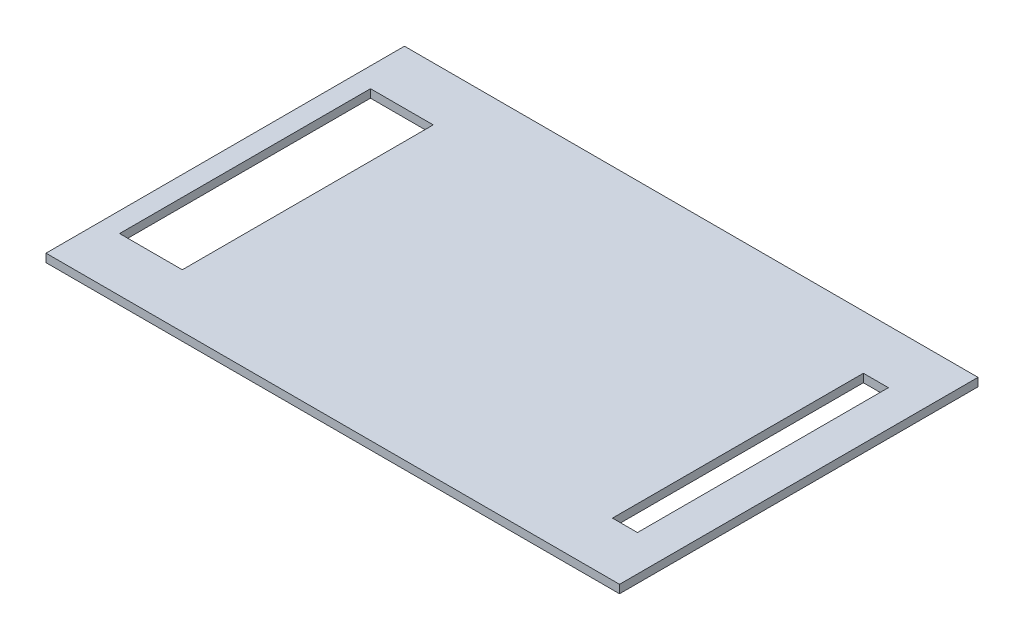
ISO-10303-21;
HEADER;
FILE_DESCRIPTION(('STEP AP214'),'2;1');
FILE_NAME('part.step','',(''),(''),'','','');
FILE_SCHEMA(('AUTOMOTIVE_DESIGN { 1 0 10303 214 1 1 1 1 }'));
ENDSEC;
DATA;
#1=APPLICATION_CONTEXT('core data for automotive mechanical design processes');
#2=APPLICATION_PROTOCOL_DEFINITION('international standard','automotive_design',2000,#1);
#3=PRODUCT_CONTEXT('',#1,'mechanical');
#4=PRODUCT('Part','Part','',(#3));
#5=PRODUCT_RELATED_PRODUCT_CATEGORY('part','',(#4));
#6=PRODUCT_DEFINITION_FORMATION('','',#4);
#7=PRODUCT_DEFINITION_CONTEXT('part definition',#1,'design');
#8=PRODUCT_DEFINITION('design','',#6,#7);
#9=PRODUCT_DEFINITION_SHAPE('','',#8);
#10=(LENGTH_UNIT() NAMED_UNIT(*) SI_UNIT(.MILLI.,.METRE.));
#11=(NAMED_UNIT(*) PLANE_ANGLE_UNIT() SI_UNIT($,.RADIAN.));
#12=(NAMED_UNIT(*) SI_UNIT($,.STERADIAN.) SOLID_ANGLE_UNIT());
#13=UNCERTAINTY_MEASURE_WITH_UNIT(LENGTH_MEASURE(1.E-05),#10,'distance_accuracy_value','');
#14=(GEOMETRIC_REPRESENTATION_CONTEXT(3) GLOBAL_UNCERTAINTY_ASSIGNED_CONTEXT((#13)) GLOBAL_UNIT_ASSIGNED_CONTEXT((#10,
#11,#12)) REPRESENTATION_CONTEXT('',''));
#15=CARTESIAN_POINT('',(0.,0.,0.));
#16=DIRECTION('',(0.,0.,1.));
#17=DIRECTION('',(1.,0.,0.));
#18=AXIS2_PLACEMENT_3D('',#15,#16,#17);
#19=CARTESIAN_POINT('',(0.,5.842,-38.1));
#20=DIRECTION('',(0.,0.,1.));
#21=DIRECTION('',(1.,0.,0.));
#22=AXIS2_PLACEMENT_3D('',#19,#20,#21);
#23=PLANE('',#22);
#24=DIRECTION('',(-1.,0.,0.));
#25=VECTOR('',#24,1.);
#26=CARTESIAN_POINT('',(0.,0.,-38.1));
#27=LINE('',#26,#25);
#28=CARTESIAN_POINT('',(-25.4,0.,-38.1));
#29=VERTEX_POINT('',#28);
#30=CARTESIAN_POINT('',(-43.1165,0.,-38.1));
#31=VERTEX_POINT('',#30);
#32=EDGE_CURVE('E175',#29,#31,#27,.T.);
#33=ORIENTED_EDGE('',*,*,#32,.T.);
#34=DIRECTION('',(0.,-1.,0.));
#35=VECTOR('',#34,1.);
#36=CARTESIAN_POINT('',(-43.1165,5.842,-38.1));
#37=LINE('',#36,#35);
#38=CARTESIAN_POINT('',(-43.1165,5.842,-38.1));
#39=VERTEX_POINT('',#38);
#40=EDGE_CURVE('E11',#39,#31,#37,.T.);
#41=ORIENTED_EDGE('',*,*,#40,.F.);
#42=DIRECTION('',(-1.,0.,0.));
#43=VECTOR('',#42,1.);
#44=CARTESIAN_POINT('',(0.,5.842,-38.1));
#45=LINE('',#44,#43);
#46=CARTESIAN_POINT('',(-25.4,5.842,-38.1));
#47=VERTEX_POINT('',#46);
#48=EDGE_CURVE('E135',#47,#39,#45,.T.);
#49=ORIENTED_EDGE('',*,*,#48,.F.);
#50=DIRECTION('',(0.,-1.,0.));
#51=VECTOR('',#50,1.);
#52=CARTESIAN_POINT('',(-25.4,5.842,-38.1));
#53=LINE('',#52,#51);
#54=EDGE_CURVE('E51',#47,#29,#53,.T.);
#55=ORIENTED_EDGE('',*,*,#54,.T.);
#56=EDGE_LOOP('',(#33,#41,#49,#55));
#57=FACE_BOUND('',#56,.T.);
#58=ADVANCED_FACE('F32',(#57),#23,.F.);
#59=CARTESIAN_POINT('',(-43.1165,5.842,0.));
#60=DIRECTION('',(-1.,0.,0.));
#61=DIRECTION('',(0.,0.,1.));
#62=AXIS2_PLACEMENT_3D('',#59,#60,#61);
#63=PLANE('',#62);
#64=DIRECTION('',(0.,0.,-1.));
#65=VECTOR('',#64,1.);
#66=CARTESIAN_POINT('',(-43.1165,0.,0.));
#67=LINE('',#66,#65);
#68=CARTESIAN_POINT('',(-43.1165,0.,-215.9));
#69=VERTEX_POINT('',#68);
#70=EDGE_CURVE('E141',#31,#69,#67,.T.);
#71=ORIENTED_EDGE('',*,*,#70,.T.);
#72=DIRECTION('',(0.,-1.,0.));
#73=VECTOR('',#72,1.);
#74=CARTESIAN_POINT('',(-43.1165,5.842,-215.9));
#75=LINE('',#74,#73);
#76=CARTESIAN_POINT('',(-43.1165,5.842,-215.9));
#77=VERTEX_POINT('',#76);
#78=EDGE_CURVE('E42',#77,#69,#75,.T.);
#79=ORIENTED_EDGE('',*,*,#78,.F.);
#80=DIRECTION('',(0.,0.,-1.));
#81=VECTOR('',#80,1.);
#82=CARTESIAN_POINT('',(-43.1165,5.842,0.));
#83=LINE('',#82,#81);
#84=EDGE_CURVE('E129',#39,#77,#83,.T.);
#85=ORIENTED_EDGE('',*,*,#84,.F.);
#86=ORIENTED_EDGE('',*,*,#40,.T.);
#87=EDGE_LOOP('',(#71,#79,#85,#86));
#88=FACE_BOUND('',#87,.T.);
#89=ADVANCED_FACE('F140',(#88),#63,.F.);
#90=CARTESIAN_POINT('',(0.,5.842,-215.9));
#91=DIRECTION('',(0.,0.,1.));
#92=DIRECTION('',(1.,0.,0.));
#93=AXIS2_PLACEMENT_3D('',#90,#91,#92);
#94=PLANE('',#93);
#95=DIRECTION('',(-1.,0.,0.));
#96=VECTOR('',#95,1.);
#97=CARTESIAN_POINT('',(0.,0.,-215.9));
#98=LINE('',#97,#96);
#99=CARTESIAN_POINT('',(-25.4,0.,-215.9));
#100=VERTEX_POINT('',#99);
#101=EDGE_CURVE('E178',#100,#69,#98,.T.);
#102=ORIENTED_EDGE('',*,*,#101,.F.);
#103=DIRECTION('',(0.,-1.,0.));
#104=VECTOR('',#103,1.);
#105=CARTESIAN_POINT('',(-25.4,5.842,-215.9));
#106=LINE('',#105,#104);
#107=CARTESIAN_POINT('',(-25.4,5.842,-215.9));
#108=VERTEX_POINT('',#107);
#109=EDGE_CURVE('E89',#108,#100,#106,.T.);
#110=ORIENTED_EDGE('',*,*,#109,.F.);
#111=DIRECTION('',(-1.,0.,0.));
#112=VECTOR('',#111,1.);
#113=CARTESIAN_POINT('',(0.,5.842,-215.9));
#114=LINE('',#113,#112);
#115=EDGE_CURVE('E134',#108,#77,#114,.T.);
#116=ORIENTED_EDGE('',*,*,#115,.T.);
#117=ORIENTED_EDGE('',*,*,#78,.T.);
#118=EDGE_LOOP('',(#102,#110,#116,#117));
#119=FACE_BOUND('',#118,.T.);
#120=ADVANCED_FACE('F145',(#119),#94,.T.);
#121=CARTESIAN_POINT('',(0.,5.842,0.));
#122=DIRECTION('',(1.,0.,0.));
#123=DIRECTION('',(0.,0.,-1.));
#124=AXIS2_PLACEMENT_3D('',#121,#122,#123);
#125=PLANE('',#124);
#126=DIRECTION('',(0.,0.,1.));
#127=VECTOR('',#126,1.);
#128=CARTESIAN_POINT('',(0.,0.,0.));
#129=LINE('',#128,#127);
#130=CARTESIAN_POINT('',(0.,0.,-254.));
#131=VERTEX_POINT('',#130);
#132=CARTESIAN_POINT('',(0.,0.,0.));
#133=VERTEX_POINT('',#132);
#134=EDGE_CURVE('E163',#131,#133,#129,.T.);
#135=ORIENTED_EDGE('',*,*,#134,.F.);
#136=DIRECTION('',(0.,-1.,0.));
#137=VECTOR('',#136,1.);
#138=CARTESIAN_POINT('',(0.,5.842,-254.));
#139=LINE('',#138,#137);
#140=CARTESIAN_POINT('',(0.,5.842,-254.));
#141=VERTEX_POINT('',#140);
#142=EDGE_CURVE('E185',#141,#131,#139,.T.);
#143=ORIENTED_EDGE('',*,*,#142,.F.);
#144=DIRECTION('',(0.,0.,1.));
#145=VECTOR('',#144,1.);
#146=CARTESIAN_POINT('',(0.,5.842,0.));
#147=LINE('',#146,#145);
#148=CARTESIAN_POINT('',(0.,5.842,0.));
#149=VERTEX_POINT('',#148);
#150=EDGE_CURVE('E349',#141,#149,#147,.T.);
#151=ORIENTED_EDGE('',*,*,#150,.T.);
#152=DIRECTION('',(0.,-1.,0.));
#153=VECTOR('',#152,1.);
#154=CARTESIAN_POINT('',(0.,5.842,0.));
#155=LINE('',#154,#153);
#156=EDGE_CURVE('E187',#149,#133,#155,.T.);
#157=ORIENTED_EDGE('',*,*,#156,.T.);
#158=EDGE_LOOP('',(#135,#143,#151,#157));
#159=FACE_BOUND('',#158,.T.);
#160=ADVANCED_FACE('F244',(#159),#125,.T.);
#161=CARTESIAN_POINT('',(0.,5.842,-254.));
#162=DIRECTION('',(0.,0.,-1.));
#163=DIRECTION('',(-1.,0.,0.));
#164=AXIS2_PLACEMENT_3D('',#161,#162,#163);
#165=PLANE('',#164);
#166=DIRECTION('',(1.,0.,0.));
#167=VECTOR('',#166,1.);
#168=CARTESIAN_POINT('',(0.,0.,-254.));
#169=LINE('',#168,#167);
#170=CARTESIAN_POINT('',(-406.4,0.,-254.));
#171=VERTEX_POINT('',#170);
#172=EDGE_CURVE('E166',#171,#131,#169,.T.);
#173=ORIENTED_EDGE('',*,*,#172,.F.);
#174=DIRECTION('',(0.,-1.,0.));
#175=VECTOR('',#174,1.);
#176=CARTESIAN_POINT('',(-406.4,5.842,-254.));
#177=LINE('',#176,#175);
#178=CARTESIAN_POINT('',(-406.4,5.842,-254.));
#179=VERTEX_POINT('',#178);
#180=EDGE_CURVE('E192',#179,#171,#177,.T.);
#181=ORIENTED_EDGE('',*,*,#180,.F.);
#182=DIRECTION('',(1.,0.,0.));
#183=VECTOR('',#182,1.);
#184=CARTESIAN_POINT('',(0.,5.842,-254.));
#185=LINE('',#184,#183);
#186=EDGE_CURVE('E346',#179,#141,#185,.T.);
#187=ORIENTED_EDGE('',*,*,#186,.T.);
#188=ORIENTED_EDGE('',*,*,#142,.T.);
#189=EDGE_LOOP('',(#173,#181,#187,#188));
#190=FACE_BOUND('',#189,.T.);
#191=ADVANCED_FACE('F240',(#190),#165,.T.);
#192=CARTESIAN_POINT('',(-406.4,5.842,0.));
#193=DIRECTION('',(1.,0.,0.));
#194=DIRECTION('',(0.,0.,-1.));
#195=AXIS2_PLACEMENT_3D('',#192,#193,#194);
#196=PLANE('',#195);
#197=DIRECTION('',(0.,0.,1.));
#198=VECTOR('',#197,1.);
#199=CARTESIAN_POINT('',(-406.4,0.,0.));
#200=LINE('',#199,#198);
#201=CARTESIAN_POINT('',(-406.4,0.,0.));
#202=VERTEX_POINT('',#201);
#203=EDGE_CURVE('E169',#171,#202,#200,.T.);
#204=ORIENTED_EDGE('',*,*,#203,.T.);
#205=DIRECTION('',(0.,-1.,0.));
#206=VECTOR('',#205,1.);
#207=CARTESIAN_POINT('',(-406.4,5.842,0.));
#208=LINE('',#207,#206);
#209=CARTESIAN_POINT('',(-406.4,5.842,0.));
#210=VERTEX_POINT('',#209);
#211=EDGE_CURVE('E189',#210,#202,#208,.T.);
#212=ORIENTED_EDGE('',*,*,#211,.F.);
#213=DIRECTION('',(0.,0.,1.));
#214=VECTOR('',#213,1.);
#215=CARTESIAN_POINT('',(-406.4,5.842,0.));
#216=LINE('',#215,#214);
#217=EDGE_CURVE('E341',#179,#210,#216,.T.);
#218=ORIENTED_EDGE('',*,*,#217,.F.);
#219=ORIENTED_EDGE('',*,*,#180,.T.);
#220=EDGE_LOOP('',(#204,#212,#218,#219));
#221=FACE_BOUND('',#220,.T.);
#222=ADVANCED_FACE('F237',(#221),#196,.F.);
#223=CARTESIAN_POINT('',(0.,5.842,-38.1));
#224=DIRECTION('',(0.,0.,-1.));
#225=DIRECTION('',(-1.,0.,0.));
#226=AXIS2_PLACEMENT_3D('',#223,#224,#225);
#227=PLANE('',#226);
#228=DIRECTION('',(1.,0.,0.));
#229=VECTOR('',#228,1.);
#230=CARTESIAN_POINT('',(0.,0.,-38.1));
#231=LINE('',#230,#229);
#232=CARTESIAN_POINT('',(-392.3665,0.,-38.1));
#233=VERTEX_POINT('',#232);
#234=CARTESIAN_POINT('',(-347.9165,0.,-38.1));
#235=VERTEX_POINT('',#234);
#236=EDGE_CURVE('E152',#233,#235,#231,.T.);
#237=ORIENTED_EDGE('',*,*,#236,.F.);
#238=DIRECTION('',(0.,-1.,0.));
#239=VECTOR('',#238,1.);
#240=CARTESIAN_POINT('',(-392.3665,5.842,-38.1));
#241=LINE('',#240,#239);
#242=CARTESIAN_POINT('',(-392.3665,5.842,-38.1));
#243=VERTEX_POINT('',#242);
#244=EDGE_CURVE('E36',#243,#233,#241,.T.);
#245=ORIENTED_EDGE('',*,*,#244,.F.);
#246=DIRECTION('',(1.,0.,0.));
#247=VECTOR('',#246,1.);
#248=CARTESIAN_POINT('',(0.,5.842,-38.1));
#249=LINE('',#248,#247);
#250=CARTESIAN_POINT('',(-347.9165,5.842,-38.1));
#251=VERTEX_POINT('',#250);
#252=EDGE_CURVE('E183',#243,#251,#249,.T.);
#253=ORIENTED_EDGE('',*,*,#252,.T.);
#254=DIRECTION('',(0.,-1.,0.));
#255=VECTOR('',#254,1.);
#256=CARTESIAN_POINT('',(-347.9165,5.842,-38.1));
#257=LINE('',#256,#255);
#258=EDGE_CURVE('E148',#251,#235,#257,.T.);
#259=ORIENTED_EDGE('',*,*,#258,.T.);
#260=EDGE_LOOP('',(#237,#245,#253,#259));
#261=FACE_BOUND('',#260,.T.);
#262=ADVANCED_FACE('F34',(#261),#227,.T.);
#263=CARTESIAN_POINT('',(-392.3665,5.842,0.));
#264=DIRECTION('',(-1.,0.,0.));
#265=DIRECTION('',(0.,0.,1.));
#266=AXIS2_PLACEMENT_3D('',#263,#264,#265);
#267=PLANE('',#266);
#268=DIRECTION('',(0.,0.,-1.));
#269=VECTOR('',#268,1.);
#270=CARTESIAN_POINT('',(-392.3665,0.,0.));
#271=LINE('',#270,#269);
#272=CARTESIAN_POINT('',(-392.3665,0.,-215.9));
#273=VERTEX_POINT('',#272);
#274=EDGE_CURVE('E155',#233,#273,#271,.T.);
#275=ORIENTED_EDGE('',*,*,#274,.T.);
#276=DIRECTION('',(0.,-1.,0.));
#277=VECTOR('',#276,1.);
#278=CARTESIAN_POINT('',(-392.3665,5.842,-215.9));
#279=LINE('',#278,#277);
#280=CARTESIAN_POINT('',(-392.3665,5.842,-215.9));
#281=VERTEX_POINT('',#280);
#282=EDGE_CURVE('E197',#281,#273,#279,.T.);
#283=ORIENTED_EDGE('',*,*,#282,.F.);
#284=DIRECTION('',(0.,0.,-1.));
#285=VECTOR('',#284,1.);
#286=CARTESIAN_POINT('',(-392.3665,5.842,0.));
#287=LINE('',#286,#285);
#288=EDGE_CURVE('E206',#243,#281,#287,.T.);
#289=ORIENTED_EDGE('',*,*,#288,.F.);
#290=ORIENTED_EDGE('',*,*,#244,.T.);
#291=EDGE_LOOP('',(#275,#283,#289,#290));
#292=FACE_BOUND('',#291,.T.);
#293=ADVANCED_FACE('F205',(#292),#267,.F.);
#294=CARTESIAN_POINT('',(0.,5.842,-215.9));
#295=DIRECTION('',(0.,0.,-1.));
#296=DIRECTION('',(-1.,0.,0.));
#297=AXIS2_PLACEMENT_3D('',#294,#295,#296);
#298=PLANE('',#297);
#299=DIRECTION('',(1.,0.,0.));
#300=VECTOR('',#299,1.);
#301=CARTESIAN_POINT('',(0.,0.,-215.9));
#302=LINE('',#301,#300);
#303=CARTESIAN_POINT('',(-347.9165,0.,-215.9));
#304=VERTEX_POINT('',#303);
#305=EDGE_CURVE('E157',#273,#304,#302,.T.);
#306=ORIENTED_EDGE('',*,*,#305,.T.);
#307=DIRECTION('',(0.,-1.,0.));
#308=VECTOR('',#307,1.);
#309=CARTESIAN_POINT('',(-347.9165,5.842,-215.9));
#310=LINE('',#309,#308);
#311=CARTESIAN_POINT('',(-347.9165,5.842,-215.9));
#312=VERTEX_POINT('',#311);
#313=EDGE_CURVE('E196',#312,#304,#310,.T.);
#314=ORIENTED_EDGE('',*,*,#313,.F.);
#315=DIRECTION('',(1.,0.,0.));
#316=VECTOR('',#315,1.);
#317=CARTESIAN_POINT('',(0.,5.842,-215.9));
#318=LINE('',#317,#316);
#319=EDGE_CURVE('E353',#281,#312,#318,.T.);
#320=ORIENTED_EDGE('',*,*,#319,.F.);
#321=ORIENTED_EDGE('',*,*,#282,.T.);
#322=EDGE_LOOP('',(#306,#314,#320,#321));
#323=FACE_BOUND('',#322,.T.);
#324=ADVANCED_FACE('F218',(#323),#298,.F.);
#325=CARTESIAN_POINT('',(0.,5.842,0.));
#326=DIRECTION('',(0.,0.,-1.));
#327=DIRECTION('',(-1.,0.,0.));
#328=AXIS2_PLACEMENT_3D('',#325,#326,#327);
#329=PLANE('',#328);
#330=DIRECTION('',(1.,0.,0.));
#331=VECTOR('',#330,1.);
#332=CARTESIAN_POINT('',(0.,0.,0.));
#333=LINE('',#332,#331);
#334=EDGE_CURVE('E172',#202,#133,#333,.T.);
#335=ORIENTED_EDGE('',*,*,#334,.T.);
#336=ORIENTED_EDGE('',*,*,#156,.F.);
#337=DIRECTION('',(1.,0.,0.));
#338=VECTOR('',#337,1.);
#339=CARTESIAN_POINT('',(0.,5.842,0.));
#340=LINE('',#339,#338);
#341=EDGE_CURVE('E340',#210,#149,#340,.T.);
#342=ORIENTED_EDGE('',*,*,#341,.F.);
#343=ORIENTED_EDGE('',*,*,#211,.T.);
#344=EDGE_LOOP('',(#335,#336,#342,#343));
#345=FACE_BOUND('',#344,.T.);
#346=ADVANCED_FACE('F220',(#345),#329,.F.);
#347=CARTESIAN_POINT('',(-347.9165,5.842,0.));
#348=DIRECTION('',(-1.,0.,0.));
#349=DIRECTION('',(0.,0.,1.));
#350=AXIS2_PLACEMENT_3D('',#347,#348,#349);
#351=PLANE('',#350);
#352=DIRECTION('',(0.,0.,-1.));
#353=VECTOR('',#352,1.);
#354=CARTESIAN_POINT('',(-347.9165,0.,0.));
#355=LINE('',#354,#353);
#356=EDGE_CURVE('E160',#235,#304,#355,.T.);
#357=ORIENTED_EDGE('',*,*,#356,.F.);
#358=ORIENTED_EDGE('',*,*,#258,.F.);
#359=DIRECTION('',(0.,0.,-1.));
#360=VECTOR('',#359,1.);
#361=CARTESIAN_POINT('',(-347.9165,5.842,0.));
#362=LINE('',#361,#360);
#363=EDGE_CURVE('E216',#251,#312,#362,.T.);
#364=ORIENTED_EDGE('',*,*,#363,.T.);
#365=ORIENTED_EDGE('',*,*,#313,.T.);
#366=EDGE_LOOP('',(#357,#358,#364,#365));
#367=FACE_BOUND('',#366,.T.);
#368=ADVANCED_FACE('F215',(#367),#351,.T.);
#369=CARTESIAN_POINT('',(-25.4,5.842,0.));
#370=DIRECTION('',(-1.,0.,0.));
#371=DIRECTION('',(0.,0.,1.));
#372=AXIS2_PLACEMENT_3D('',#369,#370,#371);
#373=PLANE('',#372);
#374=DIRECTION('',(0.,0.,-1.));
#375=VECTOR('',#374,1.);
#376=CARTESIAN_POINT('',(-25.4,0.,0.));
#377=LINE('',#376,#375);
#378=EDGE_CURVE('E180',#29,#100,#377,.T.);
#379=ORIENTED_EDGE('',*,*,#378,.F.);
#380=ORIENTED_EDGE('',*,*,#54,.F.);
#381=DIRECTION('',(0.,0.,-1.));
#382=VECTOR('',#381,1.);
#383=CARTESIAN_POINT('',(-25.4,5.842,0.));
#384=LINE('',#383,#382);
#385=EDGE_CURVE('E146',#47,#108,#384,.T.);
#386=ORIENTED_EDGE('',*,*,#385,.T.);
#387=ORIENTED_EDGE('',*,*,#109,.T.);
#388=EDGE_LOOP('',(#379,#380,#386,#387));
#389=FACE_BOUND('',#388,.T.);
#390=ADVANCED_FACE('F249',(#389),#373,.T.);
#391=CARTESIAN_POINT('',(0.,5.842,0.));
#392=DIRECTION('',(0.,1.,0.));
#393=DIRECTION('',(0.,0.,1.));
#394=AXIS2_PLACEMENT_3D('',#391,#392,#393);
#395=PLANE('',#394);
#396=ORIENTED_EDGE('',*,*,#252,.F.);
#397=ORIENTED_EDGE('',*,*,#288,.T.);
#398=ORIENTED_EDGE('',*,*,#319,.T.);
#399=ORIENTED_EDGE('',*,*,#363,.F.);
#400=EDGE_LOOP('',(#396,#397,#398,#399));
#401=FACE_BOUND('',#400,.T.);
#402=ORIENTED_EDGE('',*,*,#150,.F.);
#403=ORIENTED_EDGE('',*,*,#186,.F.);
#404=ORIENTED_EDGE('',*,*,#217,.T.);
#405=ORIENTED_EDGE('',*,*,#341,.T.);
#406=EDGE_LOOP('',(#402,#403,#404,#405));
#407=FACE_BOUND('',#406,.T.);
#408=ORIENTED_EDGE('',*,*,#48,.T.);
#409=ORIENTED_EDGE('',*,*,#84,.T.);
#410=ORIENTED_EDGE('',*,*,#115,.F.);
#411=ORIENTED_EDGE('',*,*,#385,.F.);
#412=EDGE_LOOP('',(#408,#409,#410,#411));
#413=FACE_BOUND('',#412,.T.);
#414=ADVANCED_FACE('F131',(#401,#407,#413),#395,.T.);
#415=CARTESIAN_POINT('',(0.,0.,0.));
#416=DIRECTION('',(0.,1.,0.));
#417=DIRECTION('',(0.,0.,1.));
#418=AXIS2_PLACEMENT_3D('',#415,#416,#417);
#419=PLANE('',#418);
#420=ORIENTED_EDGE('',*,*,#236,.T.);
#421=ORIENTED_EDGE('',*,*,#356,.T.);
#422=ORIENTED_EDGE('',*,*,#305,.F.);
#423=ORIENTED_EDGE('',*,*,#274,.F.);
#424=EDGE_LOOP('',(#420,#421,#422,#423));
#425=FACE_BOUND('',#424,.T.);
#426=ORIENTED_EDGE('',*,*,#134,.T.);
#427=ORIENTED_EDGE('',*,*,#334,.F.);
#428=ORIENTED_EDGE('',*,*,#203,.F.);
#429=ORIENTED_EDGE('',*,*,#172,.T.);
#430=EDGE_LOOP('',(#426,#427,#428,#429));
#431=FACE_BOUND('',#430,.T.);
#432=ORIENTED_EDGE('',*,*,#32,.F.);
#433=ORIENTED_EDGE('',*,*,#378,.T.);
#434=ORIENTED_EDGE('',*,*,#101,.T.);
#435=ORIENTED_EDGE('',*,*,#70,.F.);
#436=EDGE_LOOP('',(#432,#433,#434,#435));
#437=FACE_BOUND('',#436,.T.);
#438=ADVANCED_FACE('F209',(#425,#431,#437),#419,.F.);
#439=CLOSED_SHELL('',(#58,#89,#120,#160,#191,#222,#262,#293,#324,#346,#368,#390,#414,#438));
#440=MANIFOLD_SOLID_BREP('B2',#439);
#441=ADVANCED_BREP_SHAPE_REPRESENTATION('',(#18,#440),#14);
#442=SHAPE_DEFINITION_REPRESENTATION(#9,#441);
ENDSEC;
END-ISO-10303-21;
